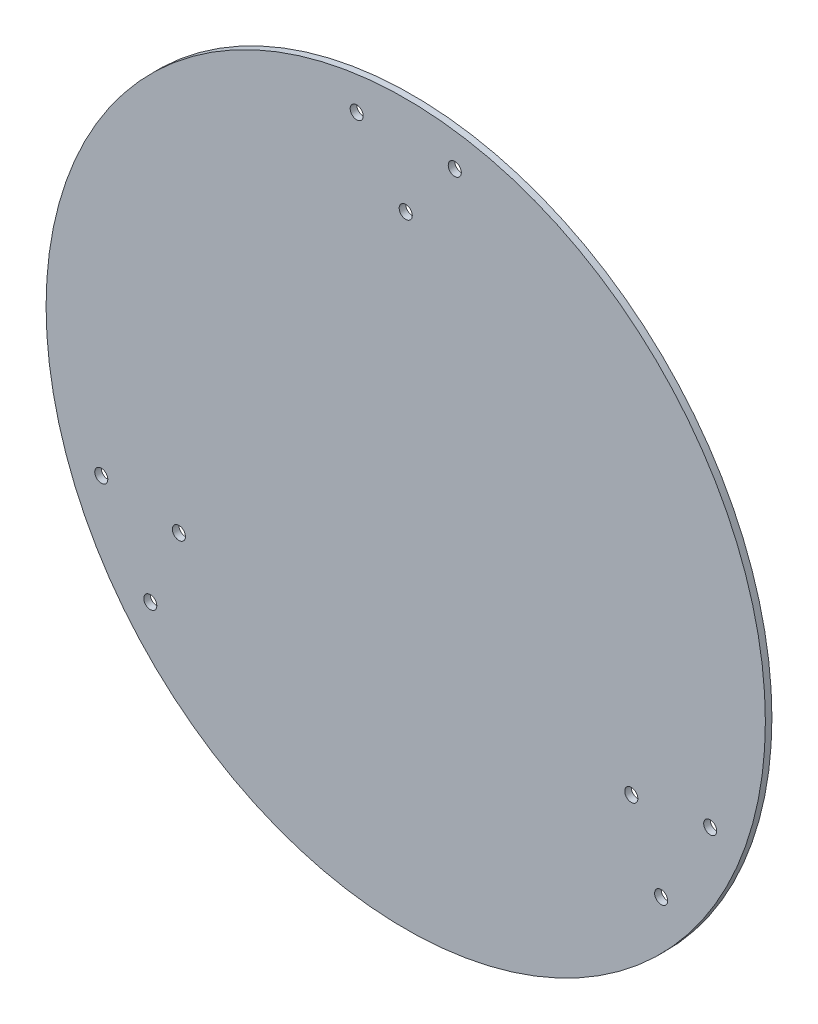
ISO-10303-21;
HEADER;
FILE_DESCRIPTION(('STEP AP214'),'2;1');
FILE_NAME('part.step','',(''),(''),'','','');
FILE_SCHEMA(('AUTOMOTIVE_DESIGN { 1 0 10303 214 1 1 1 1 }'));
ENDSEC;
DATA;
#1=APPLICATION_CONTEXT('core data for automotive mechanical design processes');
#2=APPLICATION_PROTOCOL_DEFINITION('international standard','automotive_design',2000,#1);
#3=PRODUCT_CONTEXT('',#1,'mechanical');
#4=PRODUCT('Part','Part','',(#3));
#5=PRODUCT_RELATED_PRODUCT_CATEGORY('part','',(#4));
#6=PRODUCT_DEFINITION_FORMATION('','',#4);
#7=PRODUCT_DEFINITION_CONTEXT('part definition',#1,'design');
#8=PRODUCT_DEFINITION('design','',#6,#7);
#9=PRODUCT_DEFINITION_SHAPE('','',#8);
#10=(LENGTH_UNIT() NAMED_UNIT(*) SI_UNIT(.MILLI.,.METRE.));
#11=(NAMED_UNIT(*) PLANE_ANGLE_UNIT() SI_UNIT($,.RADIAN.));
#12=(NAMED_UNIT(*) SI_UNIT($,.STERADIAN.) SOLID_ANGLE_UNIT());
#13=UNCERTAINTY_MEASURE_WITH_UNIT(LENGTH_MEASURE(1.E-05),#10,'distance_accuracy_value','');
#14=(GEOMETRIC_REPRESENTATION_CONTEXT(3) GLOBAL_UNCERTAINTY_ASSIGNED_CONTEXT((#13)) GLOBAL_UNIT_ASSIGNED_CONTEXT((#10,
#11,#12)) REPRESENTATION_CONTEXT('',''));
#15=CARTESIAN_POINT('',(0.,0.,0.));
#16=DIRECTION('',(0.,0.,1.));
#17=DIRECTION('',(1.,0.,0.));
#18=AXIS2_PLACEMENT_3D('',#15,#16,#17);
#19=CARTESIAN_POINT('',(0.,0.,2.));
#20=DIRECTION('',(0.,0.,-1.));
#21=DIRECTION('',(-1.,0.,0.));
#22=AXIS2_PLACEMENT_3D('',#19,#20,#21);
#23=CYLINDRICAL_SURFACE('',#22,110.);
#24=CARTESIAN_POINT('',(0.,0.,2.));
#25=DIRECTION('',(0.,0.,1.));
#26=DIRECTION('',(1.,0.,0.));
#27=AXIS2_PLACEMENT_3D('',#24,#25,#26);
#28=CIRCLE('',#27,110.);
#29=CARTESIAN_POINT('',(110.,0.,2.));
#30=VERTEX_POINT('',#29);
#31=EDGE_CURVE('E10',#30,#30,#28,.T.);
#32=ORIENTED_EDGE('',*,*,#31,.F.);
#33=EDGE_LOOP('',(#32));
#34=FACE_BOUND('',#33,.T.);
#35=CARTESIAN_POINT('',(0.,0.,0.));
#36=DIRECTION('',(0.,0.,1.));
#37=DIRECTION('',(1.,0.,0.));
#38=AXIS2_PLACEMENT_3D('',#35,#36,#37);
#39=CIRCLE('',#38,110.);
#40=CARTESIAN_POINT('',(110.,0.,0.));
#41=VERTEX_POINT('',#40);
#42=EDGE_CURVE('E34',#41,#41,#39,.T.);
#43=ORIENTED_EDGE('',*,*,#42,.T.);
#44=EDGE_LOOP('',(#43));
#45=FACE_BOUND('',#44,.T.);
#46=ADVANCED_FACE('F31',(#34,#45),#23,.T.);
#47=CARTESIAN_POINT('',(0.,0.,2.));
#48=DIRECTION('',(0.,0.,1.));
#49=DIRECTION('',(1.,0.,0.));
#50=AXIS2_PLACEMENT_3D('',#47,#48,#49);
#51=PLANE('',#50);
#52=CARTESIAN_POINT('',(68.9906804508183,-39.9415106054519,2.));
#53=DIRECTION('',(0.,0.,-1.));
#54=DIRECTION('',(-1.,0.,0.));
#55=AXIS2_PLACEMENT_3D('',#52,#53,#54);
#56=CIRCLE('',#55,2.);
#57=CARTESIAN_POINT('',(66.9906804508183,-39.9415106054519,2.));
#58=VERTEX_POINT('',#57);
#59=EDGE_CURVE('E88',#58,#58,#56,.T.);
#60=ORIENTED_EDGE('',*,*,#59,.T.);
#61=EDGE_LOOP('',(#60));
#62=FACE_BOUND('',#61,.T.);
#63=CARTESIAN_POINT('',(-69.3770549271928,-39.718437197509,2.));
#64=DIRECTION('',(0.,0.,-1.));
#65=DIRECTION('',(-1.,0.,0.));
#66=AXIS2_PLACEMENT_3D('',#63,#64,#65);
#67=CIRCLE('',#66,2.);
#68=CARTESIAN_POINT('',(-71.3770549271928,-39.718437197509,2.));
#69=VERTEX_POINT('',#68);
#70=EDGE_CURVE('E82',#69,#69,#67,.T.);
#71=ORIENTED_EDGE('',*,*,#70,.T.);
#72=EDGE_LOOP('',(#71));
#73=FACE_BOUND('',#72,.T.);
#74=CARTESIAN_POINT('',(93.1227189477185,-36.4439187764465,2.));
#75=DIRECTION('',(0.,0.,-1.));
#76=DIRECTION('',(-1.,0.,0.));
#77=AXIS2_PLACEMENT_3D('',#74,#75,#76);
#78=CIRCLE('',#77,1.99114491419957);
#79=CARTESIAN_POINT('',(91.1315740335189,-36.4439187764465,2.));
#80=VERTEX_POINT('',#79);
#81=EDGE_CURVE('E76',#80,#80,#78,.T.);
#82=ORIENTED_EDGE('',*,*,#81,.T.);
#83=EDGE_LOOP('',(#82));
#84=FACE_BOUND('',#83,.T.);
#85=CARTESIAN_POINT('',(78.1227189477185,-62.4246808899796,2.));
#86=DIRECTION('',(0.,0.,-1.));
#87=DIRECTION('',(-1.,0.,0.));
#88=AXIS2_PLACEMENT_3D('',#85,#86,#87);
#89=CIRCLE('',#88,2.);
#90=CARTESIAN_POINT('',(76.1227189477185,-62.4246808899796,2.));
#91=VERTEX_POINT('',#90);
#92=EDGE_CURVE('E70',#91,#91,#89,.T.);
#93=ORIENTED_EDGE('',*,*,#92,.T.);
#94=EDGE_LOOP('',(#93));
#95=FACE_BOUND('',#94,.T.);
#96=CARTESIAN_POINT('',(-78.1227189477186,-62.4246808899795,2.));
#97=DIRECTION('',(0.,0.,-1.));
#98=DIRECTION('',(-1.,0.,0.));
#99=AXIS2_PLACEMENT_3D('',#96,#97,#98);
#100=CIRCLE('',#99,1.99114491419955);
#101=CARTESIAN_POINT('',(-80.1138638619182,-62.4246808899795,2.));
#102=VERTEX_POINT('',#101);
#103=EDGE_CURVE('E64',#102,#102,#100,.T.);
#104=ORIENTED_EDGE('',*,*,#103,.T.);
#105=EDGE_LOOP('',(#104));
#106=FACE_BOUND('',#105,.T.);
#107=CARTESIAN_POINT('',(-93.1227189477186,-36.4439187764463,2.));
#108=DIRECTION('',(0.,0.,-1.));
#109=DIRECTION('',(-1.,0.,0.));
#110=AXIS2_PLACEMENT_3D('',#107,#108,#109);
#111=CIRCLE('',#110,2.);
#112=CARTESIAN_POINT('',(-95.1227189477186,-36.4439187764463,2.));
#113=VERTEX_POINT('',#112);
#114=EDGE_CURVE('E58',#113,#113,#111,.T.);
#115=ORIENTED_EDGE('',*,*,#114,.T.);
#116=EDGE_LOOP('',(#115));
#117=FACE_BOUND('',#116,.T.);
#118=CARTESIAN_POINT('',(0.,80.,2.));
#119=DIRECTION('',(0.,0.,-1.));
#120=DIRECTION('',(-1.,0.,0.));
#121=AXIS2_PLACEMENT_3D('',#118,#119,#120);
#122=CIRCLE('',#121,2.);
#123=CARTESIAN_POINT('',(-2.00000000000003,80.,2.));
#124=VERTEX_POINT('',#123);
#125=EDGE_CURVE('E52',#124,#124,#122,.T.);
#126=ORIENTED_EDGE('',*,*,#125,.T.);
#127=EDGE_LOOP('',(#126));
#128=FACE_BOUND('',#127,.T.);
#129=CARTESIAN_POINT('',(-15.,98.868599666426,2.));
#130=DIRECTION('',(0.,0.,-1.));
#131=DIRECTION('',(-1.,0.,0.));
#132=AXIS2_PLACEMENT_3D('',#129,#130,#131);
#133=CIRCLE('',#132,1.99114491419954);
#134=CARTESIAN_POINT('',(-16.9911449141995,98.868599666426,2.));
#135=VERTEX_POINT('',#134);
#136=EDGE_CURVE('E46',#135,#135,#133,.T.);
#137=ORIENTED_EDGE('',*,*,#136,.T.);
#138=EDGE_LOOP('',(#137));
#139=FACE_BOUND('',#138,.T.);
#140=CARTESIAN_POINT('',(15.,98.8685996664259,2.));
#141=DIRECTION('',(0.,0.,-1.));
#142=DIRECTION('',(-1.,0.,0.));
#143=AXIS2_PLACEMENT_3D('',#140,#141,#142);
#144=CIRCLE('',#143,2.);
#145=CARTESIAN_POINT('',(13.,98.8685996664259,2.));
#146=VERTEX_POINT('',#145);
#147=EDGE_CURVE('E41',#146,#146,#144,.T.);
#148=ORIENTED_EDGE('',*,*,#147,.T.);
#149=EDGE_LOOP('',(#148));
#150=FACE_BOUND('',#149,.T.);
#151=ORIENTED_EDGE('',*,*,#31,.T.);
#152=EDGE_LOOP('',(#151));
#153=FACE_BOUND('',#152,.T.);
#154=ADVANCED_FACE('F97',(#62,#73,#84,#95,#106,#117,#128,#139,#150,#153),#51,.T.);
#155=CARTESIAN_POINT('',(0.,0.,0.));
#156=DIRECTION('',(0.,0.,1.));
#157=DIRECTION('',(1.,0.,0.));
#158=AXIS2_PLACEMENT_3D('',#155,#156,#157);
#159=PLANE('',#158);
#160=CARTESIAN_POINT('',(68.9906804508183,-39.9415106054519,0.));
#161=DIRECTION('',(0.,0.,-1.));
#162=DIRECTION('',(-1.,0.,0.));
#163=AXIS2_PLACEMENT_3D('',#160,#161,#162);
#164=CIRCLE('',#163,2.);
#165=CARTESIAN_POINT('',(66.9906804508183,-39.9415106054519,0.));
#166=VERTEX_POINT('',#165);
#167=EDGE_CURVE('E91',#166,#166,#164,.T.);
#168=ORIENTED_EDGE('',*,*,#167,.F.);
#169=EDGE_LOOP('',(#168));
#170=FACE_BOUND('',#169,.T.);
#171=CARTESIAN_POINT('',(-69.3770549271928,-39.718437197509,0.));
#172=DIRECTION('',(0.,0.,-1.));
#173=DIRECTION('',(-1.,0.,0.));
#174=AXIS2_PLACEMENT_3D('',#171,#172,#173);
#175=CIRCLE('',#174,2.);
#176=CARTESIAN_POINT('',(-71.3770549271928,-39.718437197509,0.));
#177=VERTEX_POINT('',#176);
#178=EDGE_CURVE('E85',#177,#177,#175,.T.);
#179=ORIENTED_EDGE('',*,*,#178,.F.);
#180=EDGE_LOOP('',(#179));
#181=FACE_BOUND('',#180,.T.);
#182=CARTESIAN_POINT('',(93.1227189477185,-36.4439187764465,0.));
#183=DIRECTION('',(0.,0.,-1.));
#184=DIRECTION('',(-1.,0.,0.));
#185=AXIS2_PLACEMENT_3D('',#182,#183,#184);
#186=CIRCLE('',#185,1.99114491419957);
#187=CARTESIAN_POINT('',(91.1315740335189,-36.4439187764465,0.));
#188=VERTEX_POINT('',#187);
#189=EDGE_CURVE('E79',#188,#188,#186,.T.);
#190=ORIENTED_EDGE('',*,*,#189,.F.);
#191=EDGE_LOOP('',(#190));
#192=FACE_BOUND('',#191,.T.);
#193=CARTESIAN_POINT('',(78.1227189477185,-62.4246808899796,0.));
#194=DIRECTION('',(0.,0.,-1.));
#195=DIRECTION('',(-1.,0.,0.));
#196=AXIS2_PLACEMENT_3D('',#193,#194,#195);
#197=CIRCLE('',#196,2.);
#198=CARTESIAN_POINT('',(76.1227189477185,-62.4246808899796,0.));
#199=VERTEX_POINT('',#198);
#200=EDGE_CURVE('E73',#199,#199,#197,.T.);
#201=ORIENTED_EDGE('',*,*,#200,.F.);
#202=EDGE_LOOP('',(#201));
#203=FACE_BOUND('',#202,.T.);
#204=CARTESIAN_POINT('',(-78.1227189477186,-62.4246808899795,0.));
#205=DIRECTION('',(0.,0.,-1.));
#206=DIRECTION('',(-1.,0.,0.));
#207=AXIS2_PLACEMENT_3D('',#204,#205,#206);
#208=CIRCLE('',#207,1.99114491419955);
#209=CARTESIAN_POINT('',(-80.1138638619182,-62.4246808899795,0.));
#210=VERTEX_POINT('',#209);
#211=EDGE_CURVE('E67',#210,#210,#208,.T.);
#212=ORIENTED_EDGE('',*,*,#211,.F.);
#213=EDGE_LOOP('',(#212));
#214=FACE_BOUND('',#213,.T.);
#215=CARTESIAN_POINT('',(-93.1227189477186,-36.4439187764463,0.));
#216=DIRECTION('',(0.,0.,-1.));
#217=DIRECTION('',(-1.,0.,0.));
#218=AXIS2_PLACEMENT_3D('',#215,#216,#217);
#219=CIRCLE('',#218,2.);
#220=CARTESIAN_POINT('',(-95.1227189477186,-36.4439187764463,0.));
#221=VERTEX_POINT('',#220);
#222=EDGE_CURVE('E61',#221,#221,#219,.T.);
#223=ORIENTED_EDGE('',*,*,#222,.F.);
#224=EDGE_LOOP('',(#223));
#225=FACE_BOUND('',#224,.T.);
#226=CARTESIAN_POINT('',(0.,80.,0.));
#227=DIRECTION('',(0.,0.,-1.));
#228=DIRECTION('',(-1.,0.,0.));
#229=AXIS2_PLACEMENT_3D('',#226,#227,#228);
#230=CIRCLE('',#229,2.);
#231=CARTESIAN_POINT('',(-2.00000000000003,80.,0.));
#232=VERTEX_POINT('',#231);
#233=EDGE_CURVE('E55',#232,#232,#230,.T.);
#234=ORIENTED_EDGE('',*,*,#233,.F.);
#235=EDGE_LOOP('',(#234));
#236=FACE_BOUND('',#235,.T.);
#237=CARTESIAN_POINT('',(-15.,98.868599666426,0.));
#238=DIRECTION('',(0.,0.,-1.));
#239=DIRECTION('',(-1.,0.,0.));
#240=AXIS2_PLACEMENT_3D('',#237,#238,#239);
#241=CIRCLE('',#240,1.99114491419954);
#242=CARTESIAN_POINT('',(-16.9911449141995,98.868599666426,0.));
#243=VERTEX_POINT('',#242);
#244=EDGE_CURVE('E49',#243,#243,#241,.T.);
#245=ORIENTED_EDGE('',*,*,#244,.F.);
#246=EDGE_LOOP('',(#245));
#247=FACE_BOUND('',#246,.T.);
#248=CARTESIAN_POINT('',(15.,98.8685996664259,0.));
#249=DIRECTION('',(0.,0.,-1.));
#250=DIRECTION('',(-1.,0.,0.));
#251=AXIS2_PLACEMENT_3D('',#248,#249,#250);
#252=CIRCLE('',#251,2.);
#253=CARTESIAN_POINT('',(13.,98.8685996664259,0.));
#254=VERTEX_POINT('',#253);
#255=EDGE_CURVE('E43',#254,#254,#252,.T.);
#256=ORIENTED_EDGE('',*,*,#255,.F.);
#257=EDGE_LOOP('',(#256));
#258=FACE_BOUND('',#257,.T.);
#259=ORIENTED_EDGE('',*,*,#42,.F.);
#260=EDGE_LOOP('',(#259));
#261=FACE_BOUND('',#260,.T.);
#262=ADVANCED_FACE('F107',(#170,#181,#192,#203,#214,#225,#236,#247,#258,#261),#159,.F.);
#263=CARTESIAN_POINT('',(15.,98.8685996664259,2.));
#264=DIRECTION('',(0.,0.,-1.));
#265=DIRECTION('',(-1.,0.,0.));
#266=AXIS2_PLACEMENT_3D('',#263,#264,#265);
#267=CYLINDRICAL_SURFACE('',#266,2.);
#268=ORIENTED_EDGE('',*,*,#147,.F.);
#269=EDGE_LOOP('',(#268));
#270=FACE_BOUND('',#269,.T.);
#271=ORIENTED_EDGE('',*,*,#255,.T.);
#272=EDGE_LOOP('',(#271));
#273=FACE_BOUND('',#272,.T.);
#274=ADVANCED_FACE('F110',(#270,#273),#267,.F.);
#275=CARTESIAN_POINT('',(-15.,98.868599666426,2.));
#276=DIRECTION('',(0.,0.,-1.));
#277=DIRECTION('',(-1.,0.,0.));
#278=AXIS2_PLACEMENT_3D('',#275,#276,#277);
#279=CYLINDRICAL_SURFACE('',#278,1.99114491419954);
#280=ORIENTED_EDGE('',*,*,#136,.F.);
#281=EDGE_LOOP('',(#280));
#282=FACE_BOUND('',#281,.T.);
#283=ORIENTED_EDGE('',*,*,#244,.T.);
#284=EDGE_LOOP('',(#283));
#285=FACE_BOUND('',#284,.T.);
#286=ADVANCED_FACE('F140',(#282,#285),#279,.F.);
#287=CARTESIAN_POINT('',(0.,80.,2.));
#288=DIRECTION('',(0.,0.,-1.));
#289=DIRECTION('',(-1.,0.,0.));
#290=AXIS2_PLACEMENT_3D('',#287,#288,#289);
#291=CYLINDRICAL_SURFACE('',#290,2.);
#292=ORIENTED_EDGE('',*,*,#125,.F.);
#293=EDGE_LOOP('',(#292));
#294=FACE_BOUND('',#293,.T.);
#295=ORIENTED_EDGE('',*,*,#233,.T.);
#296=EDGE_LOOP('',(#295));
#297=FACE_BOUND('',#296,.T.);
#298=ADVANCED_FACE('F144',(#294,#297),#291,.F.);
#299=CARTESIAN_POINT('',(-93.1227189477186,-36.4439187764463,2.));
#300=DIRECTION('',(0.,0.,-1.));
#301=DIRECTION('',(-1.,0.,0.));
#302=AXIS2_PLACEMENT_3D('',#299,#300,#301);
#303=CYLINDRICAL_SURFACE('',#302,2.);
#304=ORIENTED_EDGE('',*,*,#114,.F.);
#305=EDGE_LOOP('',(#304));
#306=FACE_BOUND('',#305,.T.);
#307=ORIENTED_EDGE('',*,*,#222,.T.);
#308=EDGE_LOOP('',(#307));
#309=FACE_BOUND('',#308,.T.);
#310=ADVANCED_FACE('F148',(#306,#309),#303,.F.);
#311=CARTESIAN_POINT('',(-78.1227189477186,-62.4246808899795,2.));
#312=DIRECTION('',(0.,0.,-1.));
#313=DIRECTION('',(-1.,0.,0.));
#314=AXIS2_PLACEMENT_3D('',#311,#312,#313);
#315=CYLINDRICAL_SURFACE('',#314,1.99114491419955);
#316=ORIENTED_EDGE('',*,*,#103,.F.);
#317=EDGE_LOOP('',(#316));
#318=FACE_BOUND('',#317,.T.);
#319=ORIENTED_EDGE('',*,*,#211,.T.);
#320=EDGE_LOOP('',(#319));
#321=FACE_BOUND('',#320,.T.);
#322=ADVANCED_FACE('F152',(#318,#321),#315,.F.);
#323=CARTESIAN_POINT('',(78.1227189477185,-62.4246808899796,2.));
#324=DIRECTION('',(0.,0.,-1.));
#325=DIRECTION('',(-1.,0.,0.));
#326=AXIS2_PLACEMENT_3D('',#323,#324,#325);
#327=CYLINDRICAL_SURFACE('',#326,2.);
#328=ORIENTED_EDGE('',*,*,#92,.F.);
#329=EDGE_LOOP('',(#328));
#330=FACE_BOUND('',#329,.T.);
#331=ORIENTED_EDGE('',*,*,#200,.T.);
#332=EDGE_LOOP('',(#331));
#333=FACE_BOUND('',#332,.T.);
#334=ADVANCED_FACE('F156',(#330,#333),#327,.F.);
#335=CARTESIAN_POINT('',(93.1227189477185,-36.4439187764465,2.));
#336=DIRECTION('',(0.,0.,-1.));
#337=DIRECTION('',(-1.,0.,0.));
#338=AXIS2_PLACEMENT_3D('',#335,#336,#337);
#339=CYLINDRICAL_SURFACE('',#338,1.99114491419957);
#340=ORIENTED_EDGE('',*,*,#81,.F.);
#341=EDGE_LOOP('',(#340));
#342=FACE_BOUND('',#341,.T.);
#343=ORIENTED_EDGE('',*,*,#189,.T.);
#344=EDGE_LOOP('',(#343));
#345=FACE_BOUND('',#344,.T.);
#346=ADVANCED_FACE('F160',(#342,#345),#339,.F.);
#347=CARTESIAN_POINT('',(-69.3770549271928,-39.718437197509,2.));
#348=DIRECTION('',(0.,0.,-1.));
#349=DIRECTION('',(-1.,0.,0.));
#350=AXIS2_PLACEMENT_3D('',#347,#348,#349);
#351=CYLINDRICAL_SURFACE('',#350,2.);
#352=ORIENTED_EDGE('',*,*,#70,.F.);
#353=EDGE_LOOP('',(#352));
#354=FACE_BOUND('',#353,.T.);
#355=ORIENTED_EDGE('',*,*,#178,.T.);
#356=EDGE_LOOP('',(#355));
#357=FACE_BOUND('',#356,.T.);
#358=ADVANCED_FACE('F103',(#354,#357),#351,.F.);
#359=CARTESIAN_POINT('',(68.9906804508183,-39.9415106054519,2.));
#360=DIRECTION('',(0.,0.,-1.));
#361=DIRECTION('',(-1.,0.,0.));
#362=AXIS2_PLACEMENT_3D('',#359,#360,#361);
#363=CYLINDRICAL_SURFACE('',#362,2.);
#364=ORIENTED_EDGE('',*,*,#59,.F.);
#365=EDGE_LOOP('',(#364));
#366=FACE_BOUND('',#365,.T.);
#367=ORIENTED_EDGE('',*,*,#167,.T.);
#368=EDGE_LOOP('',(#367));
#369=FACE_BOUND('',#368,.T.);
#370=ADVANCED_FACE('F100',(#366,#369),#363,.F.);
#371=CLOSED_SHELL('',(#46,#154,#262,#274,#286,#298,#310,#322,#334,#346,#358,#370));
#372=MANIFOLD_SOLID_BREP('B2',#371);
#373=ADVANCED_BREP_SHAPE_REPRESENTATION('',(#18,#372),#14);
#374=SHAPE_DEFINITION_REPRESENTATION(#9,#373);
ENDSEC;
END-ISO-10303-21;
